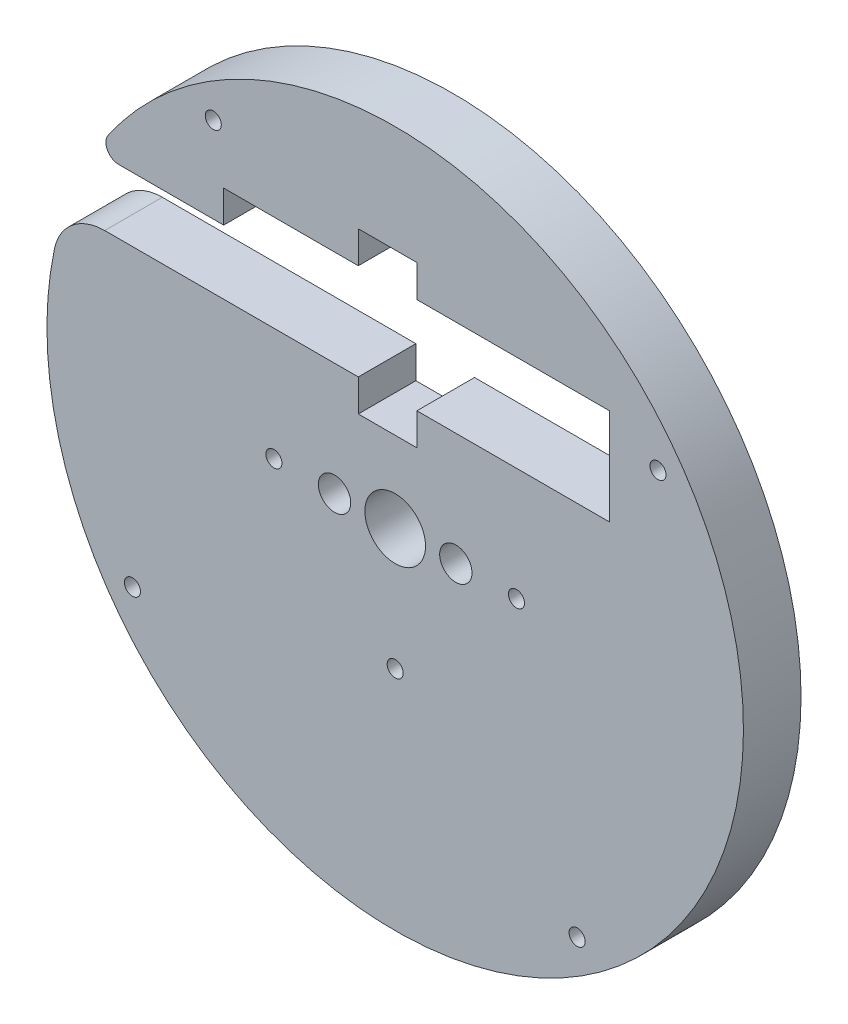
ISO-10303-21;
HEADER;
FILE_DESCRIPTION(('STEP AP214'),'2;1');
FILE_NAME('part.step','',(''),(''),'','','');
FILE_SCHEMA(('AUTOMOTIVE_DESIGN { 1 0 10303 214 1 1 1 1 }'));
ENDSEC;
DATA;
#1=APPLICATION_CONTEXT('core data for automotive mechanical design processes');
#2=APPLICATION_PROTOCOL_DEFINITION('international standard','automotive_design',2000,#1);
#3=PRODUCT_CONTEXT('',#1,'mechanical');
#4=PRODUCT('Part','Part','',(#3));
#5=PRODUCT_RELATED_PRODUCT_CATEGORY('part','',(#4));
#6=PRODUCT_DEFINITION_FORMATION('','',#4);
#7=PRODUCT_DEFINITION_CONTEXT('part definition',#1,'design');
#8=PRODUCT_DEFINITION('design','',#6,#7);
#9=PRODUCT_DEFINITION_SHAPE('','',#8);
#10=(LENGTH_UNIT() NAMED_UNIT(*) SI_UNIT(.MILLI.,.METRE.));
#11=(NAMED_UNIT(*) PLANE_ANGLE_UNIT() SI_UNIT($,.RADIAN.));
#12=(NAMED_UNIT(*) SI_UNIT($,.STERADIAN.) SOLID_ANGLE_UNIT());
#13=UNCERTAINTY_MEASURE_WITH_UNIT(LENGTH_MEASURE(1.E-05),#10,'distance_accuracy_value','');
#14=(GEOMETRIC_REPRESENTATION_CONTEXT(3) GLOBAL_UNCERTAINTY_ASSIGNED_CONTEXT((#13)) GLOBAL_UNIT_ASSIGNED_CONTEXT((#10,
#11,#12)) REPRESENTATION_CONTEXT('',''));
#15=CARTESIAN_POINT('',(0.,0.,0.));
#16=DIRECTION('',(0.,0.,1.));
#17=DIRECTION('',(1.,0.,0.));
#18=AXIS2_PLACEMENT_3D('',#15,#16,#17);
#19=CARTESIAN_POINT('',(0.,0.,5.7));
#20=DIRECTION('',(0.,0.,1.));
#21=DIRECTION('',(1.,0.,0.));
#22=AXIS2_PLACEMENT_3D('',#19,#20,#21);
#23=PLANE('',#22);
#24=CARTESIAN_POINT('',(-6.,0.,5.7));
#25=DIRECTION('',(0.,0.,1.));
#26=DIRECTION('',(1.,0.,0.));
#27=AXIS2_PLACEMENT_3D('',#24,#25,#26);
#28=CIRCLE('',#27,1.59999999999999);
#29=CARTESIAN_POINT('',(-4.40000000000001,0.,5.7));
#30=VERTEX_POINT('',#29);
#31=EDGE_CURVE('E300',#30,#30,#28,.T.);
#32=ORIENTED_EDGE('',*,*,#31,.F.);
#33=EDGE_LOOP('',(#32));
#34=FACE_BOUND('',#33,.T.);
#35=CARTESIAN_POINT('',(6.,0.,5.7));
#36=DIRECTION('',(0.,0.,1.));
#37=DIRECTION('',(1.,0.,0.));
#38=AXIS2_PLACEMENT_3D('',#35,#36,#37);
#39=CIRCLE('',#38,1.59999999999999);
#40=CARTESIAN_POINT('',(7.59999999999999,0.,5.7));
#41=VERTEX_POINT('',#40);
#42=EDGE_CURVE('E289',#41,#41,#39,.T.);
#43=ORIENTED_EDGE('',*,*,#42,.F.);
#44=EDGE_LOOP('',(#43));
#45=FACE_BOUND('',#44,.T.);
#46=CARTESIAN_POINT('',(-26.,-18.,5.7));
#47=DIRECTION('',(0.,0.,1.));
#48=DIRECTION('',(1.,0.,0.));
#49=AXIS2_PLACEMENT_3D('',#46,#47,#48);
#50=CIRCLE('',#49,0.793749999999999);
#51=CARTESIAN_POINT('',(-25.20625,-18.,5.7));
#52=VERTEX_POINT('',#51);
#53=EDGE_CURVE('E288',#52,#52,#50,.T.);
#54=ORIENTED_EDGE('',*,*,#53,.F.);
#55=EDGE_LOOP('',(#54));
#56=FACE_BOUND('',#55,.T.);
#57=CARTESIAN_POINT('',(18.,-26.,5.7));
#58=DIRECTION('',(0.,0.,1.));
#59=DIRECTION('',(1.,0.,0.));
#60=AXIS2_PLACEMENT_3D('',#57,#58,#59);
#61=CIRCLE('',#60,0.793749999999999);
#62=CARTESIAN_POINT('',(18.79375,-26.,5.7));
#63=VERTEX_POINT('',#62);
#64=EDGE_CURVE('E304',#63,#63,#61,.T.);
#65=ORIENTED_EDGE('',*,*,#64,.F.);
#66=EDGE_LOOP('',(#65));
#67=FACE_BOUND('',#66,.T.);
#68=CARTESIAN_POINT('',(26.,18.,5.7));
#69=DIRECTION('',(0.,0.,1.));
#70=DIRECTION('',(1.,0.,0.));
#71=AXIS2_PLACEMENT_3D('',#68,#69,#70);
#72=CIRCLE('',#71,0.793750000000108);
#73=CARTESIAN_POINT('',(26.7937500000001,18.,5.7));
#74=VERTEX_POINT('',#73);
#75=EDGE_CURVE('E309',#74,#74,#72,.T.);
#76=ORIENTED_EDGE('',*,*,#75,.F.);
#77=EDGE_LOOP('',(#76));
#78=FACE_BOUND('',#77,.T.);
#79=CARTESIAN_POINT('',(-11.9999999999998,-1.77032234820136E-13,5.7));
#80=DIRECTION('',(0.,0.,1.));
#81=DIRECTION('',(1.,0.,0.));
#82=AXIS2_PLACEMENT_3D('',#79,#80,#81);
#83=CIRCLE('',#82,0.793749999999992);
#84=CARTESIAN_POINT('',(-11.2062499999998,-1.77032234820136E-13,5.7));
#85=VERTEX_POINT('',#84);
#86=EDGE_CURVE('E315',#85,#85,#83,.T.);
#87=ORIENTED_EDGE('',*,*,#86,.F.);
#88=EDGE_LOOP('',(#87));
#89=FACE_BOUND('',#88,.T.);
#90=CARTESIAN_POINT('',(0.,-12.,5.7));
#91=DIRECTION('',(0.,0.,1.));
#92=DIRECTION('',(1.,0.,0.));
#93=AXIS2_PLACEMENT_3D('',#90,#91,#92);
#94=CIRCLE('',#93,0.79375);
#95=CARTESIAN_POINT('',(0.79375,-12.,5.7));
#96=VERTEX_POINT('',#95);
#97=EDGE_CURVE('E321',#96,#96,#94,.T.);
#98=ORIENTED_EDGE('',*,*,#97,.F.);
#99=EDGE_LOOP('',(#98));
#100=FACE_BOUND('',#99,.T.);
#101=CARTESIAN_POINT('',(12.0000000000002,0.,5.7));
#102=DIRECTION('',(0.,0.,1.));
#103=DIRECTION('',(1.,0.,0.));
#104=AXIS2_PLACEMENT_3D('',#101,#102,#103);
#105=CIRCLE('',#104,0.793750000000001);
#106=CARTESIAN_POINT('',(12.7937500000002,0.,5.7));
#107=VERTEX_POINT('',#106);
#108=EDGE_CURVE('E327',#107,#107,#105,.T.);
#109=ORIENTED_EDGE('',*,*,#108,.F.);
#110=EDGE_LOOP('',(#109));
#111=FACE_BOUND('',#110,.T.);
#112=CARTESIAN_POINT('',(-18.,26.,5.7));
#113=DIRECTION('',(0.,0.,1.));
#114=DIRECTION('',(1.,0.,0.));
#115=AXIS2_PLACEMENT_3D('',#112,#113,#114);
#116=CIRCLE('',#115,0.793749999999999);
#117=CARTESIAN_POINT('',(-17.20625,26.,5.7));
#118=VERTEX_POINT('',#117);
#119=EDGE_CURVE('E180',#118,#118,#116,.T.);
#120=ORIENTED_EDGE('',*,*,#119,.F.);
#121=EDGE_LOOP('',(#120));
#122=FACE_BOUND('',#121,.T.);
#123=CARTESIAN_POINT('',(0.,0.,5.7));
#124=DIRECTION('',(0.,0.,1.));
#125=DIRECTION('',(1.,0.,0.));
#126=AXIS2_PLACEMENT_3D('',#123,#124,#125);
#127=CIRCLE('',#126,34.4583333333333);
#128=CARTESIAN_POINT('',(-33.7085981311594,7.1489263629659,5.7));
#129=VERTEX_POINT('',#128);
#130=CARTESIAN_POINT('',(-28.4002117616459,19.5142180987295,5.7));
#131=VERTEX_POINT('',#130);
#132=EDGE_CURVE('E269',#129,#131,#127,.T.);
#133=ORIENTED_EDGE('',*,*,#132,.T.);
#134=CARTESIAN_POINT('',(-27.3534905349289,18.795,5.7));
#135=DIRECTION('',(0.,0.,1.));
#136=DIRECTION('',(1.,0.,0.));
#137=AXIS2_PLACEMENT_3D('',#134,#135,#136);
#138=CIRCLE('',#137,1.27);
#139=CARTESIAN_POINT('',(-27.3534905349289,17.525,5.7));
#140=VERTEX_POINT('',#139);
#141=EDGE_CURVE('E57',#131,#140,#138,.T.);
#142=ORIENTED_EDGE('',*,*,#141,.T.);
#143=DIRECTION('',(-1.,0.,0.));
#144=VECTOR('',#143,1.);
#145=CARTESIAN_POINT('',(-16.969026123402,17.525,5.7));
#146=LINE('',#145,#144);
#147=CARTESIAN_POINT('',(-16.969026123402,17.525,5.7));
#148=VERTEX_POINT('',#147);
#149=EDGE_CURVE('E216',#148,#140,#146,.T.);
#150=ORIENTED_EDGE('',*,*,#149,.F.);
#151=DIRECTION('',(0.,-1.,0.));
#152=VECTOR('',#151,1.);
#153=CARTESIAN_POINT('',(-16.969026123402,20.7,5.7));
#154=LINE('',#153,#152);
#155=CARTESIAN_POINT('',(-16.969026123402,20.7,5.7));
#156=VERTEX_POINT('',#155);
#157=EDGE_CURVE('E213',#156,#148,#154,.T.);
#158=ORIENTED_EDGE('',*,*,#157,.F.);
#159=DIRECTION('',(-1.,0.,0.));
#160=VECTOR('',#159,1.);
#161=CARTESIAN_POINT('',(-3.65210105813674,20.7,5.7));
#162=LINE('',#161,#160);
#163=CARTESIAN_POINT('',(-3.65210105813674,20.7,5.7));
#164=VERTEX_POINT('',#163);
#165=EDGE_CURVE('E210',#164,#156,#162,.T.);
#166=ORIENTED_EDGE('',*,*,#165,.F.);
#167=DIRECTION('',(0.,-1.,0.));
#168=VECTOR('',#167,1.);
#169=CARTESIAN_POINT('',(-3.65210105813674,23.875,5.7));
#170=LINE('',#169,#168);
#171=CARTESIAN_POINT('',(-3.65210105813674,23.875,5.7));
#172=VERTEX_POINT('',#171);
#173=EDGE_CURVE('E155',#172,#164,#170,.T.);
#174=ORIENTED_EDGE('',*,*,#173,.F.);
#175=DIRECTION('',(-1.,0.,0.));
#176=VECTOR('',#175,1.);
#177=CARTESIAN_POINT('',(-3.65210105813674,23.875,5.7));
#178=LINE('',#177,#176);
#179=CARTESIAN_POINT('',(2.14789894186326,23.875,5.7));
#180=VERTEX_POINT('',#179);
#181=EDGE_CURVE('E174',#180,#172,#178,.T.);
#182=ORIENTED_EDGE('',*,*,#181,.F.);
#183=DIRECTION('',(0.,1.,0.));
#184=VECTOR('',#183,1.);
#185=CARTESIAN_POINT('',(2.14789894186326,23.875,5.7));
#186=LINE('',#185,#184);
#187=CARTESIAN_POINT('',(2.14789894186326,20.7,5.7));
#188=VERTEX_POINT('',#187);
#189=EDGE_CURVE('E177',#188,#180,#186,.T.);
#190=ORIENTED_EDGE('',*,*,#189,.F.);
#191=DIRECTION('',(-1.,0.,0.));
#192=VECTOR('',#191,1.);
#193=CARTESIAN_POINT('',(2.14789894186326,20.7,5.7));
#194=LINE('',#193,#192);
#195=CARTESIAN_POINT('',(21.1978989418633,20.7,5.7));
#196=VERTEX_POINT('',#195);
#197=EDGE_CURVE('E235',#196,#188,#194,.T.);
#198=ORIENTED_EDGE('',*,*,#197,.F.);
#199=DIRECTION('',(0.,1.,0.));
#200=VECTOR('',#199,1.);
#201=CARTESIAN_POINT('',(21.1978989418633,20.7,5.7));
#202=LINE('',#201,#200);
#203=CARTESIAN_POINT('',(21.1978989418633,11.175,5.7));
#204=VERTEX_POINT('',#203);
#205=EDGE_CURVE('E232',#204,#196,#202,.T.);
#206=ORIENTED_EDGE('',*,*,#205,.F.);
#207=DIRECTION('',(1.,0.,0.));
#208=VECTOR('',#207,1.);
#209=CARTESIAN_POINT('',(2.14789894186326,11.175,5.7));
#210=LINE('',#209,#208);
#211=CARTESIAN_POINT('',(2.14789894186326,11.175,5.7));
#212=VERTEX_POINT('',#211);
#213=EDGE_CURVE('E229',#212,#204,#210,.T.);
#214=ORIENTED_EDGE('',*,*,#213,.F.);
#215=DIRECTION('',(0.,1.,0.));
#216=VECTOR('',#215,1.);
#217=CARTESIAN_POINT('',(2.14789894186326,7.99999999999999,5.7));
#218=LINE('',#217,#216);
#219=CARTESIAN_POINT('',(2.14789894186326,7.99999999999999,5.7));
#220=VERTEX_POINT('',#219);
#221=EDGE_CURVE('E226',#220,#212,#218,.T.);
#222=ORIENTED_EDGE('',*,*,#221,.F.);
#223=DIRECTION('',(1.,0.,0.));
#224=VECTOR('',#223,1.);
#225=CARTESIAN_POINT('',(-3.65210105813674,7.99999999999999,5.7));
#226=LINE('',#225,#224);
#227=CARTESIAN_POINT('',(-3.65210105813674,7.99999999999999,5.7));
#228=VERTEX_POINT('',#227);
#229=EDGE_CURVE('E223',#228,#220,#226,.T.);
#230=ORIENTED_EDGE('',*,*,#229,.F.);
#231=DIRECTION('',(0.,-1.,0.));
#232=VECTOR('',#231,1.);
#233=CARTESIAN_POINT('',(-3.65210105813674,11.175,5.7));
#234=LINE('',#233,#232);
#235=CARTESIAN_POINT('',(-3.65210105813674,11.175,5.7));
#236=VERTEX_POINT('',#235);
#237=EDGE_CURVE('E220',#236,#228,#234,.T.);
#238=ORIENTED_EDGE('',*,*,#237,.F.);
#239=DIRECTION('',(1.,0.,0.));
#240=VECTOR('',#239,1.);
#241=CARTESIAN_POINT('',(-3.65210105813674,11.175,5.7));
#242=LINE('',#241,#240);
#243=CARTESIAN_POINT('',(-28.7391274127181,11.175,5.7));
#244=VERTEX_POINT('',#243);
#245=EDGE_CURVE('E218',#244,#236,#242,.T.);
#246=ORIENTED_EDGE('',*,*,#245,.F.);
#247=CARTESIAN_POINT('',(-28.7391274127181,6.095,5.7));
#248=DIRECTION('',(0.,0.,1.));
#249=DIRECTION('',(1.,0.,0.));
#250=AXIS2_PLACEMENT_3D('',#247,#248,#249);
#251=CIRCLE('',#250,5.08);
#252=EDGE_CURVE('E276',#244,#129,#251,.T.);
#253=ORIENTED_EDGE('',*,*,#252,.T.);
#254=EDGE_LOOP('',(#133,#142,#150,#158,#166,#174,#182,#190,#198,#206,#214,#222,#230,#238,#246,#253));
#255=FACE_BOUND('',#254,.T.);
#256=CARTESIAN_POINT('',(0.,0.,5.7));
#257=DIRECTION('',(0.,0.,1.));
#258=DIRECTION('',(1.,0.,0.));
#259=AXIS2_PLACEMENT_3D('',#256,#257,#258);
#260=CIRCLE('',#259,3.);
#261=CARTESIAN_POINT('',(3.,0.,5.7));
#262=VERTEX_POINT('',#261);
#263=EDGE_CURVE('E263',#262,#262,#260,.T.);
#264=ORIENTED_EDGE('',*,*,#263,.F.);
#265=EDGE_LOOP('',(#264));
#266=FACE_BOUND('',#265,.T.);
#267=ADVANCED_FACE('F33',(#34,#45,#56,#67,#78,#89,#100,#111,#122,#255,#266),#23,.T.);
#268=CARTESIAN_POINT('',(0.,0.,0.));
#269=DIRECTION('',(0.,0.,1.));
#270=DIRECTION('',(1.,0.,0.));
#271=AXIS2_PLACEMENT_3D('',#268,#269,#270);
#272=PLANE('',#271);
#273=CARTESIAN_POINT('',(-6.,0.,0.));
#274=DIRECTION('',(0.,0.,1.));
#275=DIRECTION('',(1.,0.,0.));
#276=AXIS2_PLACEMENT_3D('',#273,#274,#275);
#277=CIRCLE('',#276,1.59999999999999);
#278=CARTESIAN_POINT('',(-4.40000000000001,0.,0.));
#279=VERTEX_POINT('',#278);
#280=EDGE_CURVE('E37',#279,#279,#277,.T.);
#281=ORIENTED_EDGE('',*,*,#280,.T.);
#282=EDGE_LOOP('',(#281));
#283=FACE_BOUND('',#282,.T.);
#284=CARTESIAN_POINT('',(6.,0.,0.));
#285=DIRECTION('',(0.,0.,1.));
#286=DIRECTION('',(1.,0.,0.));
#287=AXIS2_PLACEMENT_3D('',#284,#285,#286);
#288=CIRCLE('',#287,1.59999999999999);
#289=CARTESIAN_POINT('',(7.59999999999999,0.,0.));
#290=VERTEX_POINT('',#289);
#291=EDGE_CURVE('E286',#290,#290,#288,.T.);
#292=ORIENTED_EDGE('',*,*,#291,.T.);
#293=EDGE_LOOP('',(#292));
#294=FACE_BOUND('',#293,.T.);
#295=CARTESIAN_POINT('',(-26.,-18.,0.));
#296=DIRECTION('',(0.,0.,1.));
#297=DIRECTION('',(1.,0.,0.));
#298=AXIS2_PLACEMENT_3D('',#295,#296,#297);
#299=CIRCLE('',#298,0.793749999999999);
#300=CARTESIAN_POINT('',(-25.20625,-18.,0.));
#301=VERTEX_POINT('',#300);
#302=EDGE_CURVE('E293',#301,#301,#299,.T.);
#303=ORIENTED_EDGE('',*,*,#302,.T.);
#304=EDGE_LOOP('',(#303));
#305=FACE_BOUND('',#304,.T.);
#306=CARTESIAN_POINT('',(18.,-26.,0.));
#307=DIRECTION('',(0.,0.,1.));
#308=DIRECTION('',(1.,0.,0.));
#309=AXIS2_PLACEMENT_3D('',#306,#307,#308);
#310=CIRCLE('',#309,0.793749999999999);
#311=CARTESIAN_POINT('',(18.79375,-26.,0.));
#312=VERTEX_POINT('',#311);
#313=EDGE_CURVE('E306',#312,#312,#310,.T.);
#314=ORIENTED_EDGE('',*,*,#313,.T.);
#315=EDGE_LOOP('',(#314));
#316=FACE_BOUND('',#315,.T.);
#317=CARTESIAN_POINT('',(26.,18.,0.));
#318=DIRECTION('',(0.,0.,1.));
#319=DIRECTION('',(1.,0.,0.));
#320=AXIS2_PLACEMENT_3D('',#317,#318,#319);
#321=CIRCLE('',#320,0.793750000000108);
#322=CARTESIAN_POINT('',(26.7937500000001,18.,0.));
#323=VERTEX_POINT('',#322);
#324=EDGE_CURVE('E312',#323,#323,#321,.T.);
#325=ORIENTED_EDGE('',*,*,#324,.T.);
#326=EDGE_LOOP('',(#325));
#327=FACE_BOUND('',#326,.T.);
#328=CARTESIAN_POINT('',(-11.9999999999998,-1.77032234820136E-13,0.));
#329=DIRECTION('',(0.,0.,1.));
#330=DIRECTION('',(1.,0.,0.));
#331=AXIS2_PLACEMENT_3D('',#328,#329,#330);
#332=CIRCLE('',#331,0.793749999999992);
#333=CARTESIAN_POINT('',(-11.2062499999998,-1.77032234820136E-13,0.));
#334=VERTEX_POINT('',#333);
#335=EDGE_CURVE('E318',#334,#334,#332,.T.);
#336=ORIENTED_EDGE('',*,*,#335,.T.);
#337=EDGE_LOOP('',(#336));
#338=FACE_BOUND('',#337,.T.);
#339=CARTESIAN_POINT('',(0.,-12.,0.));
#340=DIRECTION('',(0.,0.,1.));
#341=DIRECTION('',(1.,0.,0.));
#342=AXIS2_PLACEMENT_3D('',#339,#340,#341);
#343=CIRCLE('',#342,0.79375);
#344=CARTESIAN_POINT('',(0.79375,-12.,0.));
#345=VERTEX_POINT('',#344);
#346=EDGE_CURVE('E324',#345,#345,#343,.T.);
#347=ORIENTED_EDGE('',*,*,#346,.T.);
#348=EDGE_LOOP('',(#347));
#349=FACE_BOUND('',#348,.T.);
#350=CARTESIAN_POINT('',(12.0000000000002,0.,0.));
#351=DIRECTION('',(0.,0.,1.));
#352=DIRECTION('',(1.,0.,0.));
#353=AXIS2_PLACEMENT_3D('',#350,#351,#352);
#354=CIRCLE('',#353,0.793750000000001);
#355=CARTESIAN_POINT('',(12.7937500000002,0.,0.));
#356=VERTEX_POINT('',#355);
#357=EDGE_CURVE('E330',#356,#356,#354,.T.);
#358=ORIENTED_EDGE('',*,*,#357,.T.);
#359=EDGE_LOOP('',(#358));
#360=FACE_BOUND('',#359,.T.);
#361=CARTESIAN_POINT('',(-18.,26.,0.));
#362=DIRECTION('',(0.,0.,1.));
#363=DIRECTION('',(1.,0.,0.));
#364=AXIS2_PLACEMENT_3D('',#361,#362,#363);
#365=CIRCLE('',#364,0.793749999999999);
#366=CARTESIAN_POINT('',(-17.20625,26.,0.));
#367=VERTEX_POINT('',#366);
#368=EDGE_CURVE('E211',#367,#367,#365,.T.);
#369=ORIENTED_EDGE('',*,*,#368,.T.);
#370=EDGE_LOOP('',(#369));
#371=FACE_BOUND('',#370,.T.);
#372=DIRECTION('',(-1.,0.,0.));
#373=VECTOR('',#372,1.);
#374=CARTESIAN_POINT('',(-16.969026123402,17.525,0.));
#375=LINE('',#374,#373);
#376=CARTESIAN_POINT('',(-16.969026123402,17.525,0.));
#377=VERTEX_POINT('',#376);
#378=CARTESIAN_POINT('',(-27.3534905349289,17.525,0.));
#379=VERTEX_POINT('',#378);
#380=EDGE_CURVE('E184',#377,#379,#375,.T.);
#381=ORIENTED_EDGE('',*,*,#380,.T.);
#382=CARTESIAN_POINT('',(-27.3534905349289,18.795,0.));
#383=DIRECTION('',(0.,0.,1.));
#384=DIRECTION('',(1.,0.,0.));
#385=AXIS2_PLACEMENT_3D('',#382,#383,#384);
#386=CIRCLE('',#385,1.27);
#387=CARTESIAN_POINT('',(-28.4002117616459,19.5142180987295,0.));
#388=VERTEX_POINT('',#387);
#389=EDGE_CURVE('E11',#379,#388,#386,.F.);
#390=ORIENTED_EDGE('',*,*,#389,.T.);
#391=CARTESIAN_POINT('',(0.,0.,0.));
#392=DIRECTION('',(0.,0.,1.));
#393=DIRECTION('',(1.,0.,0.));
#394=AXIS2_PLACEMENT_3D('',#391,#392,#393);
#395=CIRCLE('',#394,34.4583333333333);
#396=CARTESIAN_POINT('',(-33.7085981311594,7.1489263629659,0.));
#397=VERTEX_POINT('',#396);
#398=EDGE_CURVE('E266',#397,#388,#395,.T.);
#399=ORIENTED_EDGE('',*,*,#398,.F.);
#400=CARTESIAN_POINT('',(-28.7391274127181,6.095,0.));
#401=DIRECTION('',(0.,0.,1.));
#402=DIRECTION('',(1.,0.,0.));
#403=AXIS2_PLACEMENT_3D('',#400,#401,#402);
#404=CIRCLE('',#403,5.08);
#405=CARTESIAN_POINT('',(-28.7391274127181,11.175,0.));
#406=VERTEX_POINT('',#405);
#407=EDGE_CURVE('E280',#397,#406,#404,.F.);
#408=ORIENTED_EDGE('',*,*,#407,.T.);
#409=DIRECTION('',(1.,0.,0.));
#410=VECTOR('',#409,1.);
#411=CARTESIAN_POINT('',(-3.65210105813674,11.175,0.));
#412=LINE('',#411,#410);
#413=CARTESIAN_POINT('',(-3.65210105813674,11.175,0.));
#414=VERTEX_POINT('',#413);
#415=EDGE_CURVE('E186',#406,#414,#412,.T.);
#416=ORIENTED_EDGE('',*,*,#415,.T.);
#417=DIRECTION('',(0.,-1.,0.));
#418=VECTOR('',#417,1.);
#419=CARTESIAN_POINT('',(-3.65210105813674,11.175,0.));
#420=LINE('',#419,#418);
#421=CARTESIAN_POINT('',(-3.65210105813674,7.99999999999999,0.));
#422=VERTEX_POINT('',#421);
#423=EDGE_CURVE('E188',#414,#422,#420,.T.);
#424=ORIENTED_EDGE('',*,*,#423,.T.);
#425=DIRECTION('',(1.,0.,0.));
#426=VECTOR('',#425,1.);
#427=CARTESIAN_POINT('',(-3.65210105813674,7.99999999999999,0.));
#428=LINE('',#427,#426);
#429=CARTESIAN_POINT('',(2.14789894186326,7.99999999999999,0.));
#430=VERTEX_POINT('',#429);
#431=EDGE_CURVE('E191',#422,#430,#428,.T.);
#432=ORIENTED_EDGE('',*,*,#431,.T.);
#433=DIRECTION('',(0.,1.,0.));
#434=VECTOR('',#433,1.);
#435=CARTESIAN_POINT('',(2.14789894186326,7.99999999999999,0.));
#436=LINE('',#435,#434);
#437=CARTESIAN_POINT('',(2.14789894186326,11.175,0.));
#438=VERTEX_POINT('',#437);
#439=EDGE_CURVE('E194',#430,#438,#436,.T.);
#440=ORIENTED_EDGE('',*,*,#439,.T.);
#441=DIRECTION('',(1.,0.,0.));
#442=VECTOR('',#441,1.);
#443=CARTESIAN_POINT('',(2.14789894186326,11.175,0.));
#444=LINE('',#443,#442);
#445=CARTESIAN_POINT('',(21.1978989418633,11.175,0.));
#446=VERTEX_POINT('',#445);
#447=EDGE_CURVE('E197',#438,#446,#444,.T.);
#448=ORIENTED_EDGE('',*,*,#447,.T.);
#449=DIRECTION('',(0.,1.,0.));
#450=VECTOR('',#449,1.);
#451=CARTESIAN_POINT('',(21.1978989418633,20.7,0.));
#452=LINE('',#451,#450);
#453=CARTESIAN_POINT('',(21.1978989418633,20.7,0.));
#454=VERTEX_POINT('',#453);
#455=EDGE_CURVE('E200',#446,#454,#452,.T.);
#456=ORIENTED_EDGE('',*,*,#455,.T.);
#457=DIRECTION('',(-1.,0.,0.));
#458=VECTOR('',#457,1.);
#459=CARTESIAN_POINT('',(2.14789894186326,20.7,0.));
#460=LINE('',#459,#458);
#461=CARTESIAN_POINT('',(2.14789894186326,20.7,0.));
#462=VERTEX_POINT('',#461);
#463=EDGE_CURVE('E203',#454,#462,#460,.T.);
#464=ORIENTED_EDGE('',*,*,#463,.T.);
#465=DIRECTION('',(0.,1.,0.));
#466=VECTOR('',#465,1.);
#467=CARTESIAN_POINT('',(2.14789894186326,23.875,0.));
#468=LINE('',#467,#466);
#469=CARTESIAN_POINT('',(2.14789894186326,23.875,0.));
#470=VERTEX_POINT('',#469);
#471=EDGE_CURVE('E206',#462,#470,#468,.T.);
#472=ORIENTED_EDGE('',*,*,#471,.T.);
#473=DIRECTION('',(-1.,0.,0.));
#474=VECTOR('',#473,1.);
#475=CARTESIAN_POINT('',(-3.65210105813674,23.875,0.));
#476=LINE('',#475,#474);
#477=CARTESIAN_POINT('',(-3.65210105813674,23.875,0.));
#478=VERTEX_POINT('',#477);
#479=EDGE_CURVE('E160',#470,#478,#476,.T.);
#480=ORIENTED_EDGE('',*,*,#479,.T.);
#481=DIRECTION('',(0.,-1.,0.));
#482=VECTOR('',#481,1.);
#483=CARTESIAN_POINT('',(-3.65210105813674,23.875,0.));
#484=LINE('',#483,#482);
#485=CARTESIAN_POINT('',(-3.65210105813674,20.7,0.));
#486=VERTEX_POINT('',#485);
#487=EDGE_CURVE('E152',#478,#486,#484,.T.);
#488=ORIENTED_EDGE('',*,*,#487,.T.);
#489=DIRECTION('',(-1.,0.,0.));
#490=VECTOR('',#489,1.);
#491=CARTESIAN_POINT('',(-3.65210105813674,20.7,0.));
#492=LINE('',#491,#490);
#493=CARTESIAN_POINT('',(-16.969026123402,20.7,0.));
#494=VERTEX_POINT('',#493);
#495=EDGE_CURVE('E163',#486,#494,#492,.T.);
#496=ORIENTED_EDGE('',*,*,#495,.T.);
#497=DIRECTION('',(0.,-1.,0.));
#498=VECTOR('',#497,1.);
#499=CARTESIAN_POINT('',(-16.969026123402,20.7,0.));
#500=LINE('',#499,#498);
#501=EDGE_CURVE('E168',#494,#377,#500,.T.);
#502=ORIENTED_EDGE('',*,*,#501,.T.);
#503=EDGE_LOOP('',(#381,#390,#399,#408,#416,#424,#432,#440,#448,#456,#464,#472,#480,#488,#496,#502));
#504=FACE_BOUND('',#503,.T.);
#505=CARTESIAN_POINT('',(0.,0.,0.));
#506=DIRECTION('',(0.,0.,1.));
#507=DIRECTION('',(1.,0.,0.));
#508=AXIS2_PLACEMENT_3D('',#505,#506,#507);
#509=CIRCLE('',#508,3.);
#510=CARTESIAN_POINT('',(3.,0.,0.));
#511=VERTEX_POINT('',#510);
#512=EDGE_CURVE('E242',#511,#511,#509,.T.);
#513=ORIENTED_EDGE('',*,*,#512,.T.);
#514=EDGE_LOOP('',(#513));
#515=FACE_BOUND('',#514,.T.);
#516=ADVANCED_FACE('F170',(#283,#294,#305,#316,#327,#338,#349,#360,#371,#504,#515),#272,.F.);
#517=CARTESIAN_POINT('',(0.,0.,5.7));
#518=DIRECTION('',(0.,0.,-1.));
#519=DIRECTION('',(-1.,0.,0.));
#520=AXIS2_PLACEMENT_3D('',#517,#518,#519);
#521=CYLINDRICAL_SURFACE('',#520,34.4583333333333);
#522=ORIENTED_EDGE('',*,*,#398,.T.);
#523=DIRECTION('',(0.,0.,-1.));
#524=VECTOR('',#523,1.);
#525=CARTESIAN_POINT('',(-28.4002117616459,19.5142180987295,5.7));
#526=LINE('',#525,#524);
#527=EDGE_CURVE('E282',#388,#131,#526,.F.);
#528=ORIENTED_EDGE('',*,*,#527,.T.);
#529=ORIENTED_EDGE('',*,*,#132,.F.);
#530=DIRECTION('',(0.,0.,-1.));
#531=VECTOR('',#530,1.);
#532=CARTESIAN_POINT('',(-33.7085981311594,7.1489263629659,5.7));
#533=LINE('',#532,#531);
#534=EDGE_CURVE('E278',#129,#397,#533,.T.);
#535=ORIENTED_EDGE('',*,*,#534,.T.);
#536=EDGE_LOOP('',(#522,#528,#529,#535));
#537=FACE_BOUND('',#536,.T.);
#538=ADVANCED_FACE('F352',(#537),#521,.T.);
#539=CARTESIAN_POINT('',(0.,0.,5.7));
#540=DIRECTION('',(0.,0.,-1.));
#541=DIRECTION('',(-1.,0.,0.));
#542=AXIS2_PLACEMENT_3D('',#539,#540,#541);
#543=CYLINDRICAL_SURFACE('',#542,3.);
#544=ORIENTED_EDGE('',*,*,#263,.T.);
#545=EDGE_LOOP('',(#544));
#546=FACE_BOUND('',#545,.T.);
#547=ORIENTED_EDGE('',*,*,#512,.F.);
#548=EDGE_LOOP('',(#547));
#549=FACE_BOUND('',#548,.T.);
#550=ADVANCED_FACE('F349',(#546,#549),#543,.F.);
#551=CARTESIAN_POINT('',(-3.65210105813674,23.875,0.));
#552=DIRECTION('',(-1.,0.,0.));
#553=DIRECTION('',(0.,0.,1.));
#554=AXIS2_PLACEMENT_3D('',#551,#552,#553);
#555=PLANE('',#554);
#556=ORIENTED_EDGE('',*,*,#173,.T.);
#557=DIRECTION('',(0.,0.,1.));
#558=VECTOR('',#557,1.);
#559=CARTESIAN_POINT('',(-3.65210105813674,20.7,0.));
#560=LINE('',#559,#558);
#561=EDGE_CURVE('E148',#486,#164,#560,.T.);
#562=ORIENTED_EDGE('',*,*,#561,.F.);
#563=ORIENTED_EDGE('',*,*,#487,.F.);
#564=DIRECTION('',(0.,0.,1.));
#565=VECTOR('',#564,1.);
#566=CARTESIAN_POINT('',(-3.65210105813674,23.875,0.));
#567=LINE('',#566,#565);
#568=EDGE_CURVE('E240',#478,#172,#567,.T.);
#569=ORIENTED_EDGE('',*,*,#568,.T.);
#570=EDGE_LOOP('',(#556,#562,#563,#569));
#571=FACE_BOUND('',#570,.T.);
#572=ADVANCED_FACE('F150',(#571),#555,.F.);
#573=CARTESIAN_POINT('',(-3.65210105813674,23.875,0.));
#574=DIRECTION('',(0.,1.,0.));
#575=DIRECTION('',(0.,0.,1.));
#576=AXIS2_PLACEMENT_3D('',#573,#574,#575);
#577=PLANE('',#576);
#578=ORIENTED_EDGE('',*,*,#181,.T.);
#579=ORIENTED_EDGE('',*,*,#568,.F.);
#580=ORIENTED_EDGE('',*,*,#479,.F.);
#581=DIRECTION('',(0.,0.,1.));
#582=VECTOR('',#581,1.);
#583=CARTESIAN_POINT('',(2.14789894186326,23.875,0.));
#584=LINE('',#583,#582);
#585=EDGE_CURVE('E243',#470,#180,#584,.T.);
#586=ORIENTED_EDGE('',*,*,#585,.T.);
#587=EDGE_LOOP('',(#578,#579,#580,#586));
#588=FACE_BOUND('',#587,.T.);
#589=ADVANCED_FACE('F412',(#588),#577,.F.);
#590=CARTESIAN_POINT('',(2.14789894186326,23.875,0.));
#591=DIRECTION('',(1.,0.,0.));
#592=DIRECTION('',(0.,0.,-1.));
#593=AXIS2_PLACEMENT_3D('',#590,#591,#592);
#594=PLANE('',#593);
#595=ORIENTED_EDGE('',*,*,#189,.T.);
#596=ORIENTED_EDGE('',*,*,#585,.F.);
#597=ORIENTED_EDGE('',*,*,#471,.F.);
#598=DIRECTION('',(0.,0.,1.));
#599=VECTOR('',#598,1.);
#600=CARTESIAN_POINT('',(2.14789894186326,20.7,0.));
#601=LINE('',#600,#599);
#602=EDGE_CURVE('E245',#462,#188,#601,.T.);
#603=ORIENTED_EDGE('',*,*,#602,.T.);
#604=EDGE_LOOP('',(#595,#596,#597,#603));
#605=FACE_BOUND('',#604,.T.);
#606=ADVANCED_FACE('F409',(#605),#594,.F.);
#607=CARTESIAN_POINT('',(2.14789894186326,20.7,0.));
#608=DIRECTION('',(0.,1.,0.));
#609=DIRECTION('',(-1.,0.,0.));
#610=AXIS2_PLACEMENT_3D('',#607,#608,#609);
#611=PLANE('',#610);
#612=ORIENTED_EDGE('',*,*,#197,.T.);
#613=ORIENTED_EDGE('',*,*,#602,.F.);
#614=ORIENTED_EDGE('',*,*,#463,.F.);
#615=DIRECTION('',(0.,0.,1.));
#616=VECTOR('',#615,1.);
#617=CARTESIAN_POINT('',(21.1978989418633,20.7,0.));
#618=LINE('',#617,#616);
#619=EDGE_CURVE('E247',#454,#196,#618,.T.);
#620=ORIENTED_EDGE('',*,*,#619,.T.);
#621=EDGE_LOOP('',(#612,#613,#614,#620));
#622=FACE_BOUND('',#621,.T.);
#623=ADVANCED_FACE('F405',(#622),#611,.F.);
#624=CARTESIAN_POINT('',(21.1978989418633,20.7,0.));
#625=DIRECTION('',(1.,0.,0.));
#626=DIRECTION('',(0.,0.,-1.));
#627=AXIS2_PLACEMENT_3D('',#624,#625,#626);
#628=PLANE('',#627);
#629=ORIENTED_EDGE('',*,*,#205,.T.);
#630=ORIENTED_EDGE('',*,*,#619,.F.);
#631=ORIENTED_EDGE('',*,*,#455,.F.);
#632=DIRECTION('',(0.,0.,1.));
#633=VECTOR('',#632,1.);
#634=CARTESIAN_POINT('',(21.1978989418633,11.175,0.));
#635=LINE('',#634,#633);
#636=EDGE_CURVE('E249',#446,#204,#635,.T.);
#637=ORIENTED_EDGE('',*,*,#636,.T.);
#638=EDGE_LOOP('',(#629,#630,#631,#637));
#639=FACE_BOUND('',#638,.T.);
#640=ADVANCED_FACE('F401',(#639),#628,.F.);
#641=CARTESIAN_POINT('',(2.14789894186326,11.175,0.));
#642=DIRECTION('',(0.,-1.,0.));
#643=DIRECTION('',(1.,0.,0.));
#644=AXIS2_PLACEMENT_3D('',#641,#642,#643);
#645=PLANE('',#644);
#646=ORIENTED_EDGE('',*,*,#213,.T.);
#647=ORIENTED_EDGE('',*,*,#636,.F.);
#648=ORIENTED_EDGE('',*,*,#447,.F.);
#649=DIRECTION('',(0.,0.,1.));
#650=VECTOR('',#649,1.);
#651=CARTESIAN_POINT('',(2.14789894186326,11.175,0.));
#652=LINE('',#651,#650);
#653=EDGE_CURVE('E251',#438,#212,#652,.T.);
#654=ORIENTED_EDGE('',*,*,#653,.T.);
#655=EDGE_LOOP('',(#646,#647,#648,#654));
#656=FACE_BOUND('',#655,.T.);
#657=ADVANCED_FACE('F397',(#656),#645,.F.);
#658=CARTESIAN_POINT('',(2.14789894186326,7.99999999999999,0.));
#659=DIRECTION('',(1.,0.,0.));
#660=DIRECTION('',(0.,0.,-1.));
#661=AXIS2_PLACEMENT_3D('',#658,#659,#660);
#662=PLANE('',#661);
#663=ORIENTED_EDGE('',*,*,#221,.T.);
#664=ORIENTED_EDGE('',*,*,#653,.F.);
#665=ORIENTED_EDGE('',*,*,#439,.F.);
#666=DIRECTION('',(0.,0.,1.));
#667=VECTOR('',#666,1.);
#668=CARTESIAN_POINT('',(2.14789894186326,7.99999999999999,0.));
#669=LINE('',#668,#667);
#670=EDGE_CURVE('E253',#430,#220,#669,.T.);
#671=ORIENTED_EDGE('',*,*,#670,.T.);
#672=EDGE_LOOP('',(#663,#664,#665,#671));
#673=FACE_BOUND('',#672,.T.);
#674=ADVANCED_FACE('F393',(#673),#662,.F.);
#675=CARTESIAN_POINT('',(-3.65210105813674,7.99999999999999,0.));
#676=DIRECTION('',(0.,-1.,0.));
#677=DIRECTION('',(1.,0.,0.));
#678=AXIS2_PLACEMENT_3D('',#675,#676,#677);
#679=PLANE('',#678);
#680=ORIENTED_EDGE('',*,*,#229,.T.);
#681=ORIENTED_EDGE('',*,*,#670,.F.);
#682=ORIENTED_EDGE('',*,*,#431,.F.);
#683=DIRECTION('',(0.,0.,1.));
#684=VECTOR('',#683,1.);
#685=CARTESIAN_POINT('',(-3.65210105813674,7.99999999999999,0.));
#686=LINE('',#685,#684);
#687=EDGE_CURVE('E255',#422,#228,#686,.T.);
#688=ORIENTED_EDGE('',*,*,#687,.T.);
#689=EDGE_LOOP('',(#680,#681,#682,#688));
#690=FACE_BOUND('',#689,.T.);
#691=ADVANCED_FACE('F389',(#690),#679,.F.);
#692=CARTESIAN_POINT('',(-3.65210105813674,11.175,0.));
#693=DIRECTION('',(-1.,0.,0.));
#694=DIRECTION('',(0.,-1.,0.));
#695=AXIS2_PLACEMENT_3D('',#692,#693,#694);
#696=PLANE('',#695);
#697=ORIENTED_EDGE('',*,*,#237,.T.);
#698=ORIENTED_EDGE('',*,*,#687,.F.);
#699=ORIENTED_EDGE('',*,*,#423,.F.);
#700=DIRECTION('',(0.,0.,1.));
#701=VECTOR('',#700,1.);
#702=CARTESIAN_POINT('',(-3.65210105813674,11.175,0.));
#703=LINE('',#702,#701);
#704=EDGE_CURVE('E257',#414,#236,#703,.T.);
#705=ORIENTED_EDGE('',*,*,#704,.T.);
#706=EDGE_LOOP('',(#697,#698,#699,#705));
#707=FACE_BOUND('',#706,.T.);
#708=ADVANCED_FACE('F385',(#707),#696,.F.);
#709=CARTESIAN_POINT('',(-3.65210105813674,11.175,0.));
#710=DIRECTION('',(0.,-1.,0.));
#711=DIRECTION('',(1.,0.,0.));
#712=AXIS2_PLACEMENT_3D('',#709,#710,#711);
#713=PLANE('',#712);
#714=ORIENTED_EDGE('',*,*,#415,.F.);
#715=DIRECTION('',(0.,0.,-1.));
#716=VECTOR('',#715,1.);
#717=CARTESIAN_POINT('',(-28.7391274127181,11.175,0.));
#718=LINE('',#717,#716);
#719=EDGE_CURVE('E271',#406,#244,#718,.F.);
#720=ORIENTED_EDGE('',*,*,#719,.T.);
#721=ORIENTED_EDGE('',*,*,#245,.T.);
#722=ORIENTED_EDGE('',*,*,#704,.F.);
#723=EDGE_LOOP('',(#714,#720,#721,#722));
#724=FACE_BOUND('',#723,.T.);
#725=ADVANCED_FACE('F380',(#724),#713,.F.);
#726=CARTESIAN_POINT('',(-16.969026123402,17.525,0.));
#727=DIRECTION('',(0.,1.,0.));
#728=DIRECTION('',(0.,0.,1.));
#729=AXIS2_PLACEMENT_3D('',#726,#727,#728);
#730=PLANE('',#729);
#731=ORIENTED_EDGE('',*,*,#149,.T.);
#732=DIRECTION('',(0.,0.,-1.));
#733=VECTOR('',#732,1.);
#734=CARTESIAN_POINT('',(-27.3534905349289,17.525,0.));
#735=LINE('',#734,#733);
#736=EDGE_CURVE('E42',#140,#379,#735,.T.);
#737=ORIENTED_EDGE('',*,*,#736,.T.);
#738=ORIENTED_EDGE('',*,*,#380,.F.);
#739=DIRECTION('',(0.,0.,1.));
#740=VECTOR('',#739,1.);
#741=CARTESIAN_POINT('',(-16.969026123402,17.525,0.));
#742=LINE('',#741,#740);
#743=EDGE_CURVE('E260',#377,#148,#742,.T.);
#744=ORIENTED_EDGE('',*,*,#743,.T.);
#745=EDGE_LOOP('',(#731,#737,#738,#744));
#746=FACE_BOUND('',#745,.T.);
#747=ADVANCED_FACE('F417',(#746),#730,.F.);
#748=CARTESIAN_POINT('',(-16.969026123402,20.7,0.));
#749=DIRECTION('',(-1.,0.,0.));
#750=DIRECTION('',(0.,0.,1.));
#751=AXIS2_PLACEMENT_3D('',#748,#749,#750);
#752=PLANE('',#751);
#753=ORIENTED_EDGE('',*,*,#157,.T.);
#754=ORIENTED_EDGE('',*,*,#743,.F.);
#755=ORIENTED_EDGE('',*,*,#501,.F.);
#756=DIRECTION('',(0.,0.,1.));
#757=VECTOR('',#756,1.);
#758=CARTESIAN_POINT('',(-16.969026123402,20.7,0.));
#759=LINE('',#758,#757);
#760=EDGE_CURVE('E159',#494,#156,#759,.T.);
#761=ORIENTED_EDGE('',*,*,#760,.T.);
#762=EDGE_LOOP('',(#753,#754,#755,#761));
#763=FACE_BOUND('',#762,.T.);
#764=ADVANCED_FACE('F371',(#763),#752,.F.);
#765=CARTESIAN_POINT('',(-3.65210105813674,20.7,0.));
#766=DIRECTION('',(0.,1.,0.));
#767=DIRECTION('',(-1.,0.,0.));
#768=AXIS2_PLACEMENT_3D('',#765,#766,#767);
#769=PLANE('',#768);
#770=ORIENTED_EDGE('',*,*,#165,.T.);
#771=ORIENTED_EDGE('',*,*,#760,.F.);
#772=ORIENTED_EDGE('',*,*,#495,.F.);
#773=ORIENTED_EDGE('',*,*,#561,.T.);
#774=EDGE_LOOP('',(#770,#771,#772,#773));
#775=FACE_BOUND('',#774,.T.);
#776=ADVANCED_FACE('F164',(#775),#769,.F.);
#777=CARTESIAN_POINT('',(-28.7391274127181,6.095,5.7));
#778=DIRECTION('',(0.,0.,-1.));
#779=DIRECTION('',(-1.,0.,0.));
#780=AXIS2_PLACEMENT_3D('',#777,#778,#779);
#781=CYLINDRICAL_SURFACE('',#780,5.08);
#782=ORIENTED_EDGE('',*,*,#407,.F.);
#783=ORIENTED_EDGE('',*,*,#534,.F.);
#784=ORIENTED_EDGE('',*,*,#252,.F.);
#785=ORIENTED_EDGE('',*,*,#719,.F.);
#786=EDGE_LOOP('',(#782,#783,#784,#785));
#787=FACE_BOUND('',#786,.T.);
#788=ADVANCED_FACE('F363',(#787),#781,.T.);
#789=CARTESIAN_POINT('',(-27.3534905349289,18.795,5.7));
#790=DIRECTION('',(0.,0.,-1.));
#791=DIRECTION('',(-1.,0.,0.));
#792=AXIS2_PLACEMENT_3D('',#789,#790,#791);
#793=CYLINDRICAL_SURFACE('',#792,1.27);
#794=ORIENTED_EDGE('',*,*,#389,.F.);
#795=ORIENTED_EDGE('',*,*,#736,.F.);
#796=ORIENTED_EDGE('',*,*,#141,.F.);
#797=ORIENTED_EDGE('',*,*,#527,.F.);
#798=EDGE_LOOP('',(#794,#795,#796,#797));
#799=FACE_BOUND('',#798,.T.);
#800=ADVANCED_FACE('F35',(#799),#793,.T.);
#801=CARTESIAN_POINT('',(-18.,26.,0.));
#802=DIRECTION('',(0.,0.,1.));
#803=DIRECTION('',(1.,0.,0.));
#804=AXIS2_PLACEMENT_3D('',#801,#802,#803);
#805=CYLINDRICAL_SURFACE('',#804,0.793749999999999);
#806=ORIENTED_EDGE('',*,*,#368,.F.);
#807=EDGE_LOOP('',(#806));
#808=FACE_BOUND('',#807,.T.);
#809=ORIENTED_EDGE('',*,*,#119,.T.);
#810=EDGE_LOOP('',(#809));
#811=FACE_BOUND('',#810,.T.);
#812=ADVANCED_FACE('F340',(#808,#811),#805,.F.);
#813=CARTESIAN_POINT('',(12.0000000000002,0.,0.));
#814=DIRECTION('',(0.,0.,1.));
#815=DIRECTION('',(1.,0.,0.));
#816=AXIS2_PLACEMENT_3D('',#813,#814,#815);
#817=CYLINDRICAL_SURFACE('',#816,0.793750000000001);
#818=ORIENTED_EDGE('',*,*,#357,.F.);
#819=EDGE_LOOP('',(#818));
#820=FACE_BOUND('',#819,.T.);
#821=ORIENTED_EDGE('',*,*,#108,.T.);
#822=EDGE_LOOP('',(#821));
#823=FACE_BOUND('',#822,.T.);
#824=ADVANCED_FACE('F494',(#820,#823),#817,.F.);
#825=CARTESIAN_POINT('',(0.,-12.,0.));
#826=DIRECTION('',(0.,0.,1.));
#827=DIRECTION('',(1.,0.,0.));
#828=AXIS2_PLACEMENT_3D('',#825,#826,#827);
#829=CYLINDRICAL_SURFACE('',#828,0.79375);
#830=ORIENTED_EDGE('',*,*,#346,.F.);
#831=EDGE_LOOP('',(#830));
#832=FACE_BOUND('',#831,.T.);
#833=ORIENTED_EDGE('',*,*,#97,.T.);
#834=EDGE_LOOP('',(#833));
#835=FACE_BOUND('',#834,.T.);
#836=ADVANCED_FACE('F503',(#832,#835),#829,.F.);
#837=CARTESIAN_POINT('',(-11.9999999999998,-1.77032234820136E-13,0.));
#838=DIRECTION('',(0.,0.,1.));
#839=DIRECTION('',(1.,0.,0.));
#840=AXIS2_PLACEMENT_3D('',#837,#838,#839);
#841=CYLINDRICAL_SURFACE('',#840,0.793749999999992);
#842=ORIENTED_EDGE('',*,*,#335,.F.);
#843=EDGE_LOOP('',(#842));
#844=FACE_BOUND('',#843,.T.);
#845=ORIENTED_EDGE('',*,*,#86,.T.);
#846=EDGE_LOOP('',(#845));
#847=FACE_BOUND('',#846,.T.);
#848=ADVANCED_FACE('F512',(#844,#847),#841,.F.);
#849=CARTESIAN_POINT('',(26.,18.,0.));
#850=DIRECTION('',(0.,0.,1.));
#851=DIRECTION('',(1.,0.,0.));
#852=AXIS2_PLACEMENT_3D('',#849,#850,#851);
#853=CYLINDRICAL_SURFACE('',#852,0.793750000000108);
#854=ORIENTED_EDGE('',*,*,#324,.F.);
#855=EDGE_LOOP('',(#854));
#856=FACE_BOUND('',#855,.T.);
#857=ORIENTED_EDGE('',*,*,#75,.T.);
#858=EDGE_LOOP('',(#857));
#859=FACE_BOUND('',#858,.T.);
#860=ADVANCED_FACE('F522',(#856,#859),#853,.F.);
#861=CARTESIAN_POINT('',(18.,-26.,0.));
#862=DIRECTION('',(0.,0.,1.));
#863=DIRECTION('',(1.,0.,0.));
#864=AXIS2_PLACEMENT_3D('',#861,#862,#863);
#865=CYLINDRICAL_SURFACE('',#864,0.793749999999999);
#866=ORIENTED_EDGE('',*,*,#313,.F.);
#867=EDGE_LOOP('',(#866));
#868=FACE_BOUND('',#867,.T.);
#869=ORIENTED_EDGE('',*,*,#64,.T.);
#870=EDGE_LOOP('',(#869));
#871=FACE_BOUND('',#870,.T.);
#872=ADVANCED_FACE('F532',(#868,#871),#865,.F.);
#873=CARTESIAN_POINT('',(-26.,-18.,0.));
#874=DIRECTION('',(0.,0.,1.));
#875=DIRECTION('',(1.,0.,0.));
#876=AXIS2_PLACEMENT_3D('',#873,#874,#875);
#877=CYLINDRICAL_SURFACE('',#876,0.793749999999999);
#878=ORIENTED_EDGE('',*,*,#302,.F.);
#879=EDGE_LOOP('',(#878));
#880=FACE_BOUND('',#879,.T.);
#881=ORIENTED_EDGE('',*,*,#53,.T.);
#882=EDGE_LOOP('',(#881));
#883=FACE_BOUND('',#882,.T.);
#884=ADVANCED_FACE('F542',(#880,#883),#877,.F.);
#885=CARTESIAN_POINT('',(6.,0.,5.7));
#886=DIRECTION('',(0.,0.,1.));
#887=DIRECTION('',(1.,0.,0.));
#888=AXIS2_PLACEMENT_3D('',#885,#886,#887);
#889=CYLINDRICAL_SURFACE('',#888,1.59999999999999);
#890=ORIENTED_EDGE('',*,*,#42,.T.);
#891=EDGE_LOOP('',(#890));
#892=FACE_BOUND('',#891,.T.);
#893=ORIENTED_EDGE('',*,*,#291,.F.);
#894=EDGE_LOOP('',(#893));
#895=FACE_BOUND('',#894,.T.);
#896=ADVANCED_FACE('F552',(#892,#895),#889,.F.);
#897=CARTESIAN_POINT('',(-6.,0.,5.7));
#898=DIRECTION('',(0.,0.,1.));
#899=DIRECTION('',(1.,0.,0.));
#900=AXIS2_PLACEMENT_3D('',#897,#898,#899);
#901=CYLINDRICAL_SURFACE('',#900,1.59999999999999);
#902=ORIENTED_EDGE('',*,*,#31,.T.);
#903=EDGE_LOOP('',(#902));
#904=FACE_BOUND('',#903,.T.);
#905=ORIENTED_EDGE('',*,*,#280,.F.);
#906=EDGE_LOOP('',(#905));
#907=FACE_BOUND('',#906,.T.);
#908=ADVANCED_FACE('F571',(#904,#907),#901,.F.);
#909=CLOSED_SHELL('',(#267,#516,#538,#550,#572,#589,#606,#623,#640,#657,#674,#691,#708,#725,
#747,#764,#776,#788,#800,#812,#824,#836,#848,#860,#872,#884,#896,#908));
#910=MANIFOLD_SOLID_BREP('B2',#909);
#911=ADVANCED_BREP_SHAPE_REPRESENTATION('',(#18,#910),#14);
#912=SHAPE_DEFINITION_REPRESENTATION(#9,#911);
ENDSEC;
END-ISO-10303-21;
